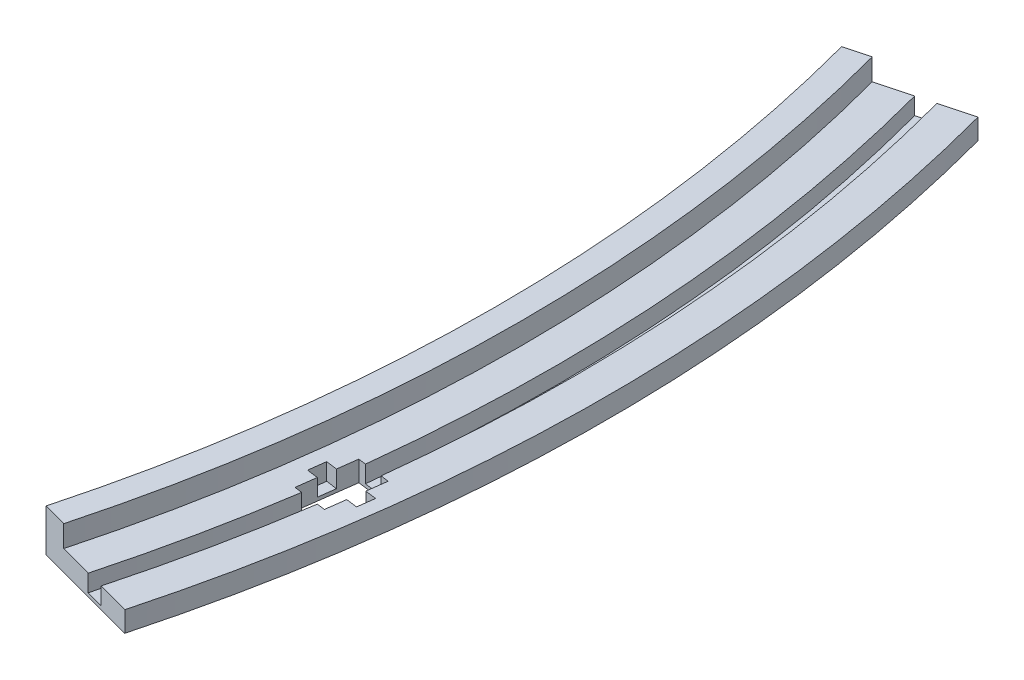
ISO-10303-21;
HEADER;
FILE_DESCRIPTION(('STEP AP214'),'2;1');
FILE_NAME('part.step','',(''),(''),'','','');
FILE_SCHEMA(('AUTOMOTIVE_DESIGN { 1 0 10303 214 1 1 1 1 }'));
ENDSEC;
DATA;
#1=APPLICATION_CONTEXT('core data for automotive mechanical design processes');
#2=APPLICATION_PROTOCOL_DEFINITION('international standard','automotive_design',2000,#1);
#3=PRODUCT_CONTEXT('',#1,'mechanical');
#4=PRODUCT('Part','Part','',(#3));
#5=PRODUCT_RELATED_PRODUCT_CATEGORY('part','',(#4));
#6=PRODUCT_DEFINITION_FORMATION('','',#4);
#7=PRODUCT_DEFINITION_CONTEXT('part definition',#1,'design');
#8=PRODUCT_DEFINITION('design','',#6,#7);
#9=PRODUCT_DEFINITION_SHAPE('','',#8);
#10=(LENGTH_UNIT() NAMED_UNIT(*) SI_UNIT(.MILLI.,.METRE.));
#11=(NAMED_UNIT(*) PLANE_ANGLE_UNIT() SI_UNIT($,.RADIAN.));
#12=(NAMED_UNIT(*) SI_UNIT($,.STERADIAN.) SOLID_ANGLE_UNIT());
#13=UNCERTAINTY_MEASURE_WITH_UNIT(LENGTH_MEASURE(1.E-05),#10,'distance_accuracy_value','');
#14=(GEOMETRIC_REPRESENTATION_CONTEXT(3) GLOBAL_UNCERTAINTY_ASSIGNED_CONTEXT((#13)) GLOBAL_UNIT_ASSIGNED_CONTEXT((#10,
#11,#12)) REPRESENTATION_CONTEXT('',''));
#15=CARTESIAN_POINT('',(0.,0.,0.));
#16=DIRECTION('',(0.,0.,1.));
#17=DIRECTION('',(1.,0.,0.));
#18=AXIS2_PLACEMENT_3D('',#15,#16,#17);
#19=CARTESIAN_POINT('',(0.,3.6,0.));
#20=DIRECTION('',(0.,1.,0.));
#21=DIRECTION('',(0.,0.,1.));
#22=AXIS2_PLACEMENT_3D('',#19,#20,#21);
#23=PLANE('',#22);
#24=DIRECTION('',(-0.965925826289068,0.,0.258819045102521));
#25=VECTOR('',#24,1.);
#26=CARTESIAN_POINT('',(280.11848962383,3.6,-75.0575230797313));
#27=LINE('',#26,#25);
#28=CARTESIAN_POINT('',(271.328564604599,3.6,-72.7022697692984));
#29=VERTEX_POINT('',#28);
#30=CARTESIAN_POINT('',(265.436417064236,3.6,-71.1234735941729));
#31=VERTEX_POINT('',#30);
#32=EDGE_CURVE('E57',#29,#31,#27,.T.);
#33=ORIENTED_EDGE('',*,*,#32,.T.);
#34=CARTESIAN_POINT('',(0.,3.6,0.));
#35=DIRECTION('',(0.,1.,0.));
#36=DIRECTION('',(0.,0.,1.));
#37=AXIS2_PLACEMENT_3D('',#34,#35,#36);
#38=CIRCLE('',#37,274.8);
#39=CARTESIAN_POINT('',(265.436417064236,3.6,71.1234735941729));
#40=VERTEX_POINT('',#39);
#41=EDGE_CURVE('E52',#40,#31,#38,.T.);
#42=ORIENTED_EDGE('',*,*,#41,.F.);
#43=DIRECTION('',(0.965925826289068,0.,0.258819045102522));
#44=VECTOR('',#43,1.);
#45=CARTESIAN_POINT('',(261.186343428564,3.6,69.9846697957218));
#46=LINE('',#45,#44);
#47=CARTESIAN_POINT('',(271.328564604599,3.6,72.7022697692983));
#48=VERTEX_POINT('',#47);
#49=EDGE_CURVE('E369',#40,#48,#46,.T.);
#50=ORIENTED_EDGE('',*,*,#49,.T.);
#51=CARTESIAN_POINT('',(0.,3.6,0.));
#52=DIRECTION('',(0.,-1.,0.));
#53=DIRECTION('',(0.,0.,1.));
#54=AXIS2_PLACEMENT_3D('',#51,#52,#53);
#55=CIRCLE('',#54,280.9);
#56=CARTESIAN_POINT('',(277.800107983747,3.6,41.6162228490094));
#57=VERTEX_POINT('',#56);
#58=EDGE_CURVE('E337',#57,#48,#55,.T.);
#59=ORIENTED_EDGE('',*,*,#58,.F.);
#60=DIRECTION('',(0.991444861373811,0.,0.130526192220051));
#61=VECTOR('',#60,1.);
#62=CARTESIAN_POINT('',(276.45620779288,3.6,41.4392950323736));
#63=LINE('',#62,#61);
#64=CARTESIAN_POINT('',(276.45620779288,3.6,41.4392950323736));
#65=VERTEX_POINT('',#64);
#66=EDGE_CURVE('E306',#65,#57,#63,.T.);
#67=ORIENTED_EDGE('',*,*,#66,.F.);
#68=DIRECTION('',(-0.130526192220048,0.,0.991444861373811));
#69=VECTOR('',#68,1.);
#70=CARTESIAN_POINT('',(277.76146971508,3.6,31.5248464186355));
#71=LINE('',#70,#69);
#72=CARTESIAN_POINT('',(276.91304946565,3.6,37.9692380175652));
#73=VERTEX_POINT('',#72);
#74=EDGE_CURVE('E287',#73,#65,#71,.T.);
#75=ORIENTED_EDGE('',*,*,#74,.F.);
#76=DIRECTION('',(0.991444861373811,0.,0.130526192220048));
#77=VECTOR('',#76,1.);
#78=CARTESIAN_POINT('',(284.844608356641,3.6,39.0134475553256));
#79=LINE('',#78,#77);
#80=CARTESIAN_POINT('',(274.930159742902,3.6,37.7081856331251));
#81=VERTEX_POINT('',#80);
#82=EDGE_CURVE('E262',#81,#73,#79,.T.);
#83=ORIENTED_EDGE('',*,*,#82,.F.);
#84=DIRECTION('',(-0.130526192220056,0.,0.99144486137381));
#85=VECTOR('',#84,1.);
#86=CARTESIAN_POINT('',(274.930159742902,3.6,37.7081856331251));
#87=LINE('',#86,#85);
#88=CARTESIAN_POINT('',(275.321738319563,3.6,34.7338510490037));
#89=VERTEX_POINT('',#88);
#90=EDGE_CURVE('E244',#89,#81,#87,.T.);
#91=ORIENTED_EDGE('',*,*,#90,.F.);
#92=DIRECTION('',(-0.991444861373811,0.,-0.130526192220048));
#93=VECTOR('',#92,1.);
#94=CARTESIAN_POINT('',(275.321738319563,3.6,34.7338510490037));
#95=LINE('',#94,#93);
#96=CARTESIAN_POINT('',(277.30462804231,3.6,34.9949034334438));
#97=VERTEX_POINT('',#96);
#98=EDGE_CURVE('E267',#97,#89,#95,.T.);
#99=ORIENTED_EDGE('',*,*,#98,.F.);
#100=CARTESIAN_POINT('',(277.76146971508,3.6,31.5248464186355));
#101=VERTEX_POINT('',#100);
#102=EDGE_CURVE('E302',#101,#97,#71,.T.);
#103=ORIENTED_EDGE('',*,*,#102,.F.);
#104=DIRECTION('',(-0.99144486137381,0.,-0.130526192220052));
#105=VECTOR('',#104,1.);
#106=CARTESIAN_POINT('',(283.710138883323,3.6,32.3080035719558));
#107=LINE('',#106,#105);
#108=CARTESIAN_POINT('',(279.105369905948,3.6,31.7017742352713));
#109=VERTEX_POINT('',#108);
#110=EDGE_CURVE('E312',#109,#101,#107,.T.);
#111=ORIENTED_EDGE('',*,*,#110,.F.);
#112=EDGE_CURVE('E353',#29,#109,#55,.T.);
#113=ORIENTED_EDGE('',*,*,#112,.F.);
#114=EDGE_LOOP('',(#33,#42,#50,#59,#67,#75,#83,#91,#99,#103,#111,#113));
#115=FACE_BOUND('',#114,.T.);
#116=ADVANCED_FACE('F37',(#115),#23,.T.);
#117=CARTESIAN_POINT('',(0.,0.599999999999999,0.));
#118=DIRECTION('',(0.,1.,0.));
#119=DIRECTION('',(0.,0.,1.));
#120=AXIS2_PLACEMENT_3D('',#117,#118,#119);
#121=CYLINDRICAL_SURFACE('',#120,280.9);
#122=ORIENTED_EDGE('',*,*,#112,.T.);
#123=DIRECTION('',(0.,1.,0.));
#124=VECTOR('',#123,1.);
#125=CARTESIAN_POINT('',(279.105369905948,0.599999999999999,31.7017742352713));
#126=LINE('',#125,#124);
#127=CARTESIAN_POINT('',(279.105369905948,0.599999999999999,31.7017742352713));
#128=VERTEX_POINT('',#127);
#129=EDGE_CURVE('E334',#109,#128,#126,.F.);
#130=ORIENTED_EDGE('',*,*,#129,.T.);
#131=CARTESIAN_POINT('',(0.,0.599999999999999,0.));
#132=DIRECTION('',(0.,-1.,0.));
#133=DIRECTION('',(0.,0.,1.));
#134=AXIS2_PLACEMENT_3D('',#131,#132,#133);
#135=CIRCLE('',#134,280.9);
#136=CARTESIAN_POINT('',(271.328564604599,0.599999999999999,-72.7022697692984));
#137=VERTEX_POINT('',#136);
#138=EDGE_CURVE('E338',#137,#128,#135,.T.);
#139=ORIENTED_EDGE('',*,*,#138,.F.);
#140=DIRECTION('',(0.,1.,0.));
#141=VECTOR('',#140,1.);
#142=CARTESIAN_POINT('',(271.328564604599,0.599999999999999,-72.7022697692984));
#143=LINE('',#142,#141);
#144=EDGE_CURVE('E360',#137,#29,#143,.T.);
#145=ORIENTED_EDGE('',*,*,#144,.T.);
#146=EDGE_LOOP('',(#122,#130,#139,#145));
#147=FACE_BOUND('',#146,.T.);
#148=ADVANCED_FACE('F436',(#147),#121,.T.);
#149=CARTESIAN_POINT('',(0.,0.599999999999999,0.));
#150=DIRECTION('',(0.,1.,0.));
#151=DIRECTION('',(0.,0.,1.));
#152=AXIS2_PLACEMENT_3D('',#149,#150,#151);
#153=CYLINDRICAL_SURFACE('',#152,284.1);
#154=CARTESIAN_POINT('',(0.,0.599999999999999,0.));
#155=DIRECTION('',(0.,1.,0.));
#156=DIRECTION('',(0.,0.,1.));
#157=AXIS2_PLACEMENT_3D('',#154,#155,#156);
#158=CIRCLE('',#157,284.1);
#159=CARTESIAN_POINT('',(282.278490521001,0.599999999999999,32.1195234893891));
#160=VERTEX_POINT('',#159);
#161=CARTESIAN_POINT('',(274.419527248724,0.599999999999999,-73.5304907136264));
#162=VERTEX_POINT('',#161);
#163=EDGE_CURVE('E345',#160,#162,#158,.T.);
#164=ORIENTED_EDGE('',*,*,#163,.F.);
#165=DIRECTION('',(0.,1.,0.));
#166=VECTOR('',#165,1.);
#167=CARTESIAN_POINT('',(282.278490521001,0.599999999999999,32.1195234893891));
#168=LINE('',#167,#166);
#169=CARTESIAN_POINT('',(282.278490521001,3.6,32.1195234893891));
#170=VERTEX_POINT('',#169);
#171=EDGE_CURVE('E331',#160,#170,#168,.T.);
#172=ORIENTED_EDGE('',*,*,#171,.T.);
#173=CARTESIAN_POINT('',(0.,3.6,0.));
#174=DIRECTION('',(0.,1.,0.));
#175=DIRECTION('',(0.,0.,1.));
#176=AXIS2_PLACEMENT_3D('',#173,#174,#175);
#177=CIRCLE('',#176,284.1);
#178=CARTESIAN_POINT('',(274.419527248724,3.6,-73.5304907136264));
#179=VERTEX_POINT('',#178);
#180=EDGE_CURVE('E356',#170,#179,#177,.T.);
#181=ORIENTED_EDGE('',*,*,#180,.T.);
#182=DIRECTION('',(0.,1.,0.));
#183=VECTOR('',#182,1.);
#184=CARTESIAN_POINT('',(274.419527248724,0.599999999999999,-73.5304907136264));
#185=LINE('',#184,#183);
#186=EDGE_CURVE('E362',#162,#179,#185,.T.);
#187=ORIENTED_EDGE('',*,*,#186,.F.);
#188=EDGE_LOOP('',(#164,#172,#181,#187));
#189=FACE_BOUND('',#188,.T.);
#190=ADVANCED_FACE('F428',(#189),#153,.F.);
#191=CARTESIAN_POINT('',(0.,0.599999999999999,0.));
#192=DIRECTION('',(0.,1.,0.));
#193=DIRECTION('',(0.,0.,1.));
#194=AXIS2_PLACEMENT_3D('',#191,#192,#193);
#195=PLANE('',#194);
#196=DIRECTION('',(-0.99144486137381,0.,-0.130526192220052));
#197=VECTOR('',#196,1.);
#198=CARTESIAN_POINT('',(0.652630961100261,0.599999999999999,-4.95722430686906));
#199=LINE('',#198,#197);
#200=EDGE_CURVE('E392',#160,#128,#199,.T.);
#201=ORIENTED_EDGE('',*,*,#200,.F.);
#202=ORIENTED_EDGE('',*,*,#163,.T.);
#203=DIRECTION('',(-0.965925826289068,0.,0.258819045102521));
#204=VECTOR('',#203,1.);
#205=CARTESIAN_POINT('',(271.328564604599,0.599999999999999,-72.7022697692984));
#206=LINE('',#205,#204);
#207=EDGE_CURVE('E349',#162,#137,#206,.T.);
#208=ORIENTED_EDGE('',*,*,#207,.T.);
#209=ORIENTED_EDGE('',*,*,#138,.T.);
#210=EDGE_LOOP('',(#201,#202,#208,#209));
#211=FACE_BOUND('',#210,.T.);
#212=ADVANCED_FACE('F432',(#211),#195,.T.);
#213=CARTESIAN_POINT('',(0.,3.6,0.));
#214=DIRECTION('',(0.,-1.,0.));
#215=DIRECTION('',(0.,0.,-1.));
#216=AXIS2_PLACEMENT_3D('',#213,#214,#215);
#217=CYLINDRICAL_SURFACE('',#216,270.4);
#218=CARTESIAN_POINT('',(0.,0.,0.));
#219=DIRECTION('',(0.,-1.,0.));
#220=DIRECTION('',(0.,0.,1.));
#221=AXIS2_PLACEMENT_3D('',#218,#219,#220);
#222=CIRCLE('',#221,270.4);
#223=CARTESIAN_POINT('',(261.186343428564,0.,-69.9846697957218));
#224=VERTEX_POINT('',#223);
#225=CARTESIAN_POINT('',(261.186343428564,0.,69.9846697957218));
#226=VERTEX_POINT('',#225);
#227=EDGE_CURVE('E216',#224,#226,#222,.T.);
#228=ORIENTED_EDGE('',*,*,#227,.T.);
#229=DIRECTION('',(0.,-1.,0.));
#230=VECTOR('',#229,1.);
#231=CARTESIAN_POINT('',(261.186343428564,3.6,69.9846697957218));
#232=LINE('',#231,#230);
#233=CARTESIAN_POINT('',(261.186343428564,7.4,69.9846697957218));
#234=VERTEX_POINT('',#233);
#235=EDGE_CURVE('E210',#234,#226,#232,.T.);
#236=ORIENTED_EDGE('',*,*,#235,.F.);
#237=CARTESIAN_POINT('',(0.,7.4,0.));
#238=DIRECTION('',(0.,-1.,0.));
#239=DIRECTION('',(0.,0.,1.));
#240=AXIS2_PLACEMENT_3D('',#237,#238,#239);
#241=CIRCLE('',#240,270.4);
#242=CARTESIAN_POINT('',(261.186343428564,7.4,-69.9846697957218));
#243=VERTEX_POINT('',#242);
#244=EDGE_CURVE('E214',#243,#234,#241,.T.);
#245=ORIENTED_EDGE('',*,*,#244,.F.);
#246=DIRECTION('',(0.,-1.,0.));
#247=VECTOR('',#246,1.);
#248=CARTESIAN_POINT('',(261.186343428564,3.6,-69.9846697957218));
#249=LINE('',#248,#247);
#250=EDGE_CURVE('E377',#243,#224,#249,.T.);
#251=ORIENTED_EDGE('',*,*,#250,.T.);
#252=EDGE_LOOP('',(#228,#236,#245,#251));
#253=FACE_BOUND('',#252,.T.);
#254=ADVANCED_FACE('F39',(#253),#217,.F.);
#255=CARTESIAN_POINT('',(261.186343428564,3.6,69.9846697957218));
#256=DIRECTION('',(0.258819045102522,0.,-0.965925826289068));
#257=DIRECTION('',(-0.965925826289068,0.,-0.258819045102522));
#258=AXIS2_PLACEMENT_3D('',#255,#256,#257);
#259=PLANE('',#258);
#260=DIRECTION('',(0.965925826289068,0.,0.25881904510252));
#261=VECTOR('',#260,1.);
#262=CARTESIAN_POINT('',(271.328564604599,0.599999999999999,72.7022697692983));
#263=LINE('',#262,#261);
#264=CARTESIAN_POINT('',(271.328564604599,0.599999999999999,72.7022697692983));
#265=VERTEX_POINT('',#264);
#266=CARTESIAN_POINT('',(274.419527248724,0.599999999999999,73.5304907136264));
#267=VERTEX_POINT('',#266);
#268=EDGE_CURVE('E341',#265,#267,#263,.T.);
#269=ORIENTED_EDGE('',*,*,#268,.F.);
#270=DIRECTION('',(0.,1.,0.));
#271=VECTOR('',#270,1.);
#272=CARTESIAN_POINT('',(271.328564604599,0.599999999999999,72.7022697692983));
#273=LINE('',#272,#271);
#274=EDGE_CURVE('E352',#265,#48,#273,.T.);
#275=ORIENTED_EDGE('',*,*,#274,.T.);
#276=ORIENTED_EDGE('',*,*,#49,.F.);
#277=DIRECTION('',(0.,-1.,0.));
#278=VECTOR('',#277,1.);
#279=CARTESIAN_POINT('',(265.436417064236,7.4,71.1234735941729));
#280=LINE('',#279,#278);
#281=CARTESIAN_POINT('',(265.436417064236,7.4,71.1234735941729));
#282=VERTEX_POINT('',#281);
#283=EDGE_CURVE('E226',#282,#40,#280,.T.);
#284=ORIENTED_EDGE('',*,*,#283,.F.);
#285=DIRECTION('',(0.965925826289066,0.,0.258819045102528));
#286=VECTOR('',#285,1.);
#287=CARTESIAN_POINT('',(265.436417064236,7.4,71.1234735941729));
#288=LINE('',#287,#286);
#289=EDGE_CURVE('E222',#234,#282,#288,.T.);
#290=ORIENTED_EDGE('',*,*,#289,.F.);
#291=ORIENTED_EDGE('',*,*,#235,.T.);
#292=DIRECTION('',(0.965925826289068,0.,0.258819045102522));
#293=VECTOR('',#292,1.);
#294=CARTESIAN_POINT('',(261.186343428564,0.,69.9846697957218));
#295=LINE('',#294,#293);
#296=CARTESIAN_POINT('',(280.11848962383,0.,75.0575230797312));
#297=VERTEX_POINT('',#296);
#298=EDGE_CURVE('E379',#226,#297,#295,.T.);
#299=ORIENTED_EDGE('',*,*,#298,.T.);
#300=DIRECTION('',(0.,-1.,0.));
#301=VECTOR('',#300,1.);
#302=CARTESIAN_POINT('',(280.11848962383,3.6,75.0575230797312));
#303=LINE('',#302,#301);
#304=CARTESIAN_POINT('',(280.11848962383,3.6,75.0575230797312));
#305=VERTEX_POINT('',#304);
#306=EDGE_CURVE('E219',#305,#297,#303,.T.);
#307=ORIENTED_EDGE('',*,*,#306,.F.);
#308=CARTESIAN_POINT('',(274.419527248724,3.6,73.5304907136264));
#309=VERTEX_POINT('',#308);
#310=EDGE_CURVE('E372',#309,#305,#46,.T.);
#311=ORIENTED_EDGE('',*,*,#310,.F.);
#312=DIRECTION('',(0.,1.,0.));
#313=VECTOR('',#312,1.);
#314=CARTESIAN_POINT('',(274.419527248724,0.599999999999999,73.5304907136264));
#315=LINE('',#314,#313);
#316=EDGE_CURVE('E365',#267,#309,#315,.T.);
#317=ORIENTED_EDGE('',*,*,#316,.F.);
#318=EDGE_LOOP('',(#269,#275,#276,#284,#290,#291,#299,#307,#311,#317));
#319=FACE_BOUND('',#318,.T.);
#320=ADVANCED_FACE('F224',(#319),#259,.F.);
#321=CARTESIAN_POINT('',(0.,3.6,0.));
#322=DIRECTION('',(0.,-1.,0.));
#323=DIRECTION('',(0.,0.,-1.));
#324=AXIS2_PLACEMENT_3D('',#321,#322,#323);
#325=CYLINDRICAL_SURFACE('',#324,290.);
#326=CARTESIAN_POINT('',(0.,0.,0.));
#327=DIRECTION('',(0.,1.,0.));
#328=DIRECTION('',(0.,0.,1.));
#329=AXIS2_PLACEMENT_3D('',#326,#327,#328);
#330=CIRCLE('',#329,290.);
#331=CARTESIAN_POINT('',(280.11848962383,0.,-75.0575230797313));
#332=VERTEX_POINT('',#331);
#333=EDGE_CURVE('E381',#297,#332,#330,.T.);
#334=ORIENTED_EDGE('',*,*,#333,.T.);
#335=DIRECTION('',(0.,-1.,0.));
#336=VECTOR('',#335,1.);
#337=CARTESIAN_POINT('',(280.11848962383,3.6,-75.0575230797313));
#338=LINE('',#337,#336);
#339=CARTESIAN_POINT('',(280.11848962383,3.6,-75.0575230797313));
#340=VERTEX_POINT('',#339);
#341=EDGE_CURVE('E386',#340,#332,#338,.T.);
#342=ORIENTED_EDGE('',*,*,#341,.F.);
#343=CARTESIAN_POINT('',(0.,3.6,0.));
#344=DIRECTION('',(0.,1.,0.));
#345=DIRECTION('',(0.,0.,1.));
#346=AXIS2_PLACEMENT_3D('',#343,#344,#345);
#347=CIRCLE('',#346,290.);
#348=EDGE_CURVE('E371',#305,#340,#347,.T.);
#349=ORIENTED_EDGE('',*,*,#348,.F.);
#350=ORIENTED_EDGE('',*,*,#306,.T.);
#351=EDGE_LOOP('',(#334,#342,#349,#350));
#352=FACE_BOUND('',#351,.T.);
#353=ADVANCED_FACE('F470',(#352),#325,.T.);
#354=CARTESIAN_POINT('',(280.11848962383,3.6,-75.0575230797313));
#355=DIRECTION('',(0.258819045102521,0.,0.965925826289068));
#356=DIRECTION('',(0.965925826289068,0.,-0.258819045102521));
#357=AXIS2_PLACEMENT_3D('',#354,#355,#356);
#358=PLANE('',#357);
#359=ORIENTED_EDGE('',*,*,#32,.F.);
#360=ORIENTED_EDGE('',*,*,#144,.F.);
#361=ORIENTED_EDGE('',*,*,#207,.F.);
#362=ORIENTED_EDGE('',*,*,#186,.T.);
#363=EDGE_CURVE('E374',#340,#179,#27,.T.);
#364=ORIENTED_EDGE('',*,*,#363,.F.);
#365=ORIENTED_EDGE('',*,*,#341,.T.);
#366=DIRECTION('',(-0.965925826289068,0.,0.258819045102521));
#367=VECTOR('',#366,1.);
#368=CARTESIAN_POINT('',(280.11848962383,0.,-75.0575230797313));
#369=LINE('',#368,#367);
#370=EDGE_CURVE('E383',#332,#224,#369,.T.);
#371=ORIENTED_EDGE('',*,*,#370,.T.);
#372=ORIENTED_EDGE('',*,*,#250,.F.);
#373=DIRECTION('',(-0.965925826289066,0.,0.258819045102528));
#374=VECTOR('',#373,1.);
#375=CARTESIAN_POINT('',(261.186343428564,7.4,-69.9846697957218));
#376=LINE('',#375,#374);
#377=CARTESIAN_POINT('',(265.436417064236,7.4,-71.1234735941729));
#378=VERTEX_POINT('',#377);
#379=EDGE_CURVE('E234',#378,#243,#376,.T.);
#380=ORIENTED_EDGE('',*,*,#379,.F.);
#381=DIRECTION('',(0.,-1.,0.));
#382=VECTOR('',#381,1.);
#383=CARTESIAN_POINT('',(265.436417064236,7.4,-71.1234735941729));
#384=LINE('',#383,#382);
#385=EDGE_CURVE('E239',#378,#31,#384,.T.);
#386=ORIENTED_EDGE('',*,*,#385,.T.);
#387=EDGE_LOOP('',(#359,#360,#361,#362,#364,#365,#371,#372,#380,#386));
#388=FACE_BOUND('',#387,.T.);
#389=ADVANCED_FACE('F439',(#388),#358,.F.);
#390=CARTESIAN_POINT('',(285.236186933301,3.6,36.0391129712042));
#391=VERTEX_POINT('',#390);
#392=CARTESIAN_POINT('',(283.253297210553,3.6,35.7780605867641));
#393=VERTEX_POINT('',#392);
#394=EDGE_CURVE('E249',#391,#393,#95,.T.);
#395=ORIENTED_EDGE('',*,*,#394,.F.);
#396=DIRECTION('',(0.130526192220038,0.,-0.991444861373812));
#397=VECTOR('',#396,1.);
#398=CARTESIAN_POINT('',(285.236186933301,3.6,36.0391129712042));
#399=LINE('',#398,#397);
#400=CARTESIAN_POINT('',(284.844608356641,3.6,39.0134475553256));
#401=VERTEX_POINT('',#400);
#402=EDGE_CURVE('E264',#401,#391,#399,.T.);
#403=ORIENTED_EDGE('',*,*,#402,.F.);
#404=CARTESIAN_POINT('',(282.861718633893,3.6,38.7523951708855));
#405=VERTEX_POINT('',#404);
#406=EDGE_CURVE('E261',#405,#401,#79,.T.);
#407=ORIENTED_EDGE('',*,*,#406,.F.);
#408=DIRECTION('',(0.130526192220054,0.,-0.99144486137381));
#409=VECTOR('',#408,1.);
#410=CARTESIAN_POINT('',(282.404876961123,3.6,42.2224521856939));
#411=LINE('',#410,#409);
#412=CARTESIAN_POINT('',(282.404876961123,3.6,42.2224521856939));
#413=VERTEX_POINT('',#412);
#414=EDGE_CURVE('E309',#413,#405,#411,.T.);
#415=ORIENTED_EDGE('',*,*,#414,.F.);
#416=CARTESIAN_POINT('',(280.9732285988,3.6,42.0339721031272));
#417=VERTEX_POINT('',#416);
#418=EDGE_CURVE('E305',#417,#413,#63,.T.);
#419=ORIENTED_EDGE('',*,*,#418,.F.);
#420=EDGE_CURVE('E357',#309,#417,#177,.T.);
#421=ORIENTED_EDGE('',*,*,#420,.F.);
#422=ORIENTED_EDGE('',*,*,#310,.T.);
#423=ORIENTED_EDGE('',*,*,#348,.T.);
#424=ORIENTED_EDGE('',*,*,#363,.T.);
#425=ORIENTED_EDGE('',*,*,#180,.F.);
#426=CARTESIAN_POINT('',(283.710138883323,3.6,32.3080035719558));
#427=VERTEX_POINT('',#426);
#428=EDGE_CURVE('E292',#427,#170,#107,.T.);
#429=ORIENTED_EDGE('',*,*,#428,.F.);
#430=EDGE_CURVE('E308',#393,#427,#411,.T.);
#431=ORIENTED_EDGE('',*,*,#430,.F.);
#432=EDGE_LOOP('',(#395,#403,#407,#415,#419,#421,#422,#423,#424,#425,#429,#431));
#433=FACE_BOUND('',#432,.T.);
#434=ADVANCED_FACE('F408',(#433),#23,.T.);
#435=CARTESIAN_POINT('',(0.,0.,0.));
#436=DIRECTION('',(0.,1.,0.));
#437=DIRECTION('',(0.,0.,1.));
#438=AXIS2_PLACEMENT_3D('',#435,#436,#437);
#439=PLANE('',#438);
#440=DIRECTION('',(-0.99144486137381,0.,-0.130526192220052));
#441=VECTOR('',#440,1.);
#442=CARTESIAN_POINT('',(283.710138883323,0.,32.3080035719558));
#443=LINE('',#442,#441);
#444=CARTESIAN_POINT('',(283.710138883323,0.,32.3080035719558));
#445=VERTEX_POINT('',#444);
#446=CARTESIAN_POINT('',(277.76146971508,0.,31.5248464186355));
#447=VERTEX_POINT('',#446);
#448=EDGE_CURVE('E298',#445,#447,#443,.T.);
#449=ORIENTED_EDGE('',*,*,#448,.T.);
#450=DIRECTION('',(-0.130526192220048,0.,0.991444861373811));
#451=VECTOR('',#450,1.);
#452=CARTESIAN_POINT('',(277.76146971508,0.,31.5248464186355));
#453=LINE('',#452,#451);
#454=CARTESIAN_POINT('',(276.45620779288,0.,41.4392950323736));
#455=VERTEX_POINT('',#454);
#456=EDGE_CURVE('E288',#447,#455,#453,.T.);
#457=ORIENTED_EDGE('',*,*,#456,.T.);
#458=DIRECTION('',(0.991444861373811,0.,0.130526192220051));
#459=VECTOR('',#458,1.);
#460=CARTESIAN_POINT('',(276.45620779288,0.,41.4392950323736));
#461=LINE('',#460,#459);
#462=CARTESIAN_POINT('',(282.404876961123,0.,42.2224521856939));
#463=VERTEX_POINT('',#462);
#464=EDGE_CURVE('E291',#455,#463,#461,.T.);
#465=ORIENTED_EDGE('',*,*,#464,.T.);
#466=DIRECTION('',(0.130526192220054,0.,-0.99144486137381));
#467=VECTOR('',#466,1.);
#468=CARTESIAN_POINT('',(282.404876961123,0.,42.2224521856939));
#469=LINE('',#468,#467);
#470=EDGE_CURVE('E295',#463,#445,#469,.T.);
#471=ORIENTED_EDGE('',*,*,#470,.T.);
#472=EDGE_LOOP('',(#449,#457,#465,#471));
#473=FACE_BOUND('',#472,.T.);
#474=ORIENTED_EDGE('',*,*,#227,.F.);
#475=ORIENTED_EDGE('',*,*,#370,.F.);
#476=ORIENTED_EDGE('',*,*,#333,.F.);
#477=ORIENTED_EDGE('',*,*,#298,.F.);
#478=EDGE_LOOP('',(#474,#475,#476,#477));
#479=FACE_BOUND('',#478,.T.);
#480=ADVANCED_FACE('F464',(#473,#479),#439,.F.);
#481=CARTESIAN_POINT('',(277.800107983747,0.599999999999999,41.6162228490094));
#482=VERTEX_POINT('',#481);
#483=EDGE_CURVE('E342',#482,#265,#135,.T.);
#484=ORIENTED_EDGE('',*,*,#483,.F.);
#485=DIRECTION('',(0.,1.,0.));
#486=VECTOR('',#485,1.);
#487=CARTESIAN_POINT('',(277.800107983747,0.599999999999999,41.6162228490094));
#488=LINE('',#487,#486);
#489=EDGE_CURVE('E328',#482,#57,#488,.T.);
#490=ORIENTED_EDGE('',*,*,#489,.T.);
#491=ORIENTED_EDGE('',*,*,#58,.T.);
#492=ORIENTED_EDGE('',*,*,#274,.F.);
#493=EDGE_LOOP('',(#484,#490,#491,#492));
#494=FACE_BOUND('',#493,.T.);
#495=ADVANCED_FACE('F461',(#494),#121,.T.);
#496=ORIENTED_EDGE('',*,*,#420,.T.);
#497=DIRECTION('',(0.,1.,0.));
#498=VECTOR('',#497,1.);
#499=CARTESIAN_POINT('',(280.9732285988,0.599999999999999,42.0339721031272));
#500=LINE('',#499,#498);
#501=CARTESIAN_POINT('',(280.9732285988,0.599999999999999,42.0339721031272));
#502=VERTEX_POINT('',#501);
#503=EDGE_CURVE('E317',#417,#502,#500,.F.);
#504=ORIENTED_EDGE('',*,*,#503,.T.);
#505=EDGE_CURVE('E346',#267,#502,#158,.T.);
#506=ORIENTED_EDGE('',*,*,#505,.F.);
#507=ORIENTED_EDGE('',*,*,#316,.T.);
#508=EDGE_LOOP('',(#496,#504,#506,#507));
#509=FACE_BOUND('',#508,.T.);
#510=ADVANCED_FACE('F490',(#509),#153,.F.);
#511=DIRECTION('',(0.99144486137381,0.,0.130526192220051));
#512=VECTOR('',#511,1.);
#513=CARTESIAN_POINT('',(-0.652630961100292,0.599999999999999,4.95722430686934));
#514=LINE('',#513,#512);
#515=EDGE_CURVE('E218',#482,#502,#514,.T.);
#516=ORIENTED_EDGE('',*,*,#515,.F.);
#517=ORIENTED_EDGE('',*,*,#483,.T.);
#518=ORIENTED_EDGE('',*,*,#268,.T.);
#519=ORIENTED_EDGE('',*,*,#505,.T.);
#520=EDGE_LOOP('',(#516,#517,#518,#519));
#521=FACE_BOUND('',#520,.T.);
#522=ADVANCED_FACE('F485',(#521),#195,.T.);
#523=CARTESIAN_POINT('',(283.710138883323,0.,32.3080035719558));
#524=DIRECTION('',(0.130526192220052,0.,-0.99144486137381));
#525=DIRECTION('',(-0.99144486137381,0.,-0.130526192220052));
#526=AXIS2_PLACEMENT_3D('',#523,#524,#525);
#527=PLANE('',#526);
#528=ORIENTED_EDGE('',*,*,#110,.T.);
#529=DIRECTION('',(0.,1.,0.));
#530=VECTOR('',#529,1.);
#531=CARTESIAN_POINT('',(277.76146971508,0.,31.5248464186355));
#532=LINE('',#531,#530);
#533=EDGE_CURVE('E314',#447,#101,#532,.T.);
#534=ORIENTED_EDGE('',*,*,#533,.F.);
#535=ORIENTED_EDGE('',*,*,#448,.F.);
#536=DIRECTION('',(0.,1.,0.));
#537=VECTOR('',#536,1.);
#538=CARTESIAN_POINT('',(283.710138883323,0.,32.3080035719558));
#539=LINE('',#538,#537);
#540=EDGE_CURVE('E318',#445,#427,#539,.T.);
#541=ORIENTED_EDGE('',*,*,#540,.T.);
#542=ORIENTED_EDGE('',*,*,#428,.T.);
#543=ORIENTED_EDGE('',*,*,#171,.F.);
#544=ORIENTED_EDGE('',*,*,#200,.T.);
#545=ORIENTED_EDGE('',*,*,#129,.F.);
#546=EDGE_LOOP('',(#528,#534,#535,#541,#542,#543,#544,#545));
#547=FACE_BOUND('',#546,.T.);
#548=ADVANCED_FACE('F423',(#547),#527,.F.);
#549=CARTESIAN_POINT('',(276.45620779288,0.,41.4392950323736));
#550=DIRECTION('',(-0.130526192220051,0.,0.99144486137381));
#551=DIRECTION('',(0.99144486137381,0.,0.130526192220051));
#552=AXIS2_PLACEMENT_3D('',#549,#550,#551);
#553=PLANE('',#552);
#554=ORIENTED_EDGE('',*,*,#515,.T.);
#555=ORIENTED_EDGE('',*,*,#503,.F.);
#556=ORIENTED_EDGE('',*,*,#418,.T.);
#557=DIRECTION('',(0.,1.,0.));
#558=VECTOR('',#557,1.);
#559=CARTESIAN_POINT('',(282.404876961123,0.,42.2224521856939));
#560=LINE('',#559,#558);
#561=EDGE_CURVE('E321',#463,#413,#560,.T.);
#562=ORIENTED_EDGE('',*,*,#561,.F.);
#563=ORIENTED_EDGE('',*,*,#464,.F.);
#564=DIRECTION('',(0.,1.,0.));
#565=VECTOR('',#564,1.);
#566=CARTESIAN_POINT('',(276.45620779288,0.,41.4392950323736));
#567=LINE('',#566,#565);
#568=EDGE_CURVE('E301',#455,#65,#567,.T.);
#569=ORIENTED_EDGE('',*,*,#568,.T.);
#570=ORIENTED_EDGE('',*,*,#66,.T.);
#571=ORIENTED_EDGE('',*,*,#489,.F.);
#572=EDGE_LOOP('',(#554,#555,#556,#562,#563,#569,#570,#571));
#573=FACE_BOUND('',#572,.T.);
#574=ADVANCED_FACE('F498',(#573),#553,.F.);
#575=CARTESIAN_POINT('',(277.76146971508,0.,31.5248464186355));
#576=DIRECTION('',(-0.991444861373811,0.,-0.130526192220048));
#577=DIRECTION('',(-0.130526192220048,0.,0.991444861373811));
#578=AXIS2_PLACEMENT_3D('',#575,#576,#577);
#579=PLANE('',#578);
#580=ORIENTED_EDGE('',*,*,#102,.T.);
#581=DIRECTION('',(0.,-1.,0.));
#582=VECTOR('',#581,1.);
#583=CARTESIAN_POINT('',(277.30462804231,0.,34.9949034334438));
#584=LINE('',#583,#582);
#585=CARTESIAN_POINT('',(277.30462804231,0.599999999999999,34.9949034334438));
#586=VERTEX_POINT('',#585);
#587=EDGE_CURVE('E284',#97,#586,#584,.T.);
#588=ORIENTED_EDGE('',*,*,#587,.T.);
#589=DIRECTION('',(-0.130526192220048,0.,0.991444861373811));
#590=VECTOR('',#589,1.);
#591=CARTESIAN_POINT('',(277.76146971508,0.599999999999999,31.5248464186355));
#592=LINE('',#591,#590);
#593=CARTESIAN_POINT('',(276.91304946565,0.599999999999999,37.9692380175652));
#594=VERTEX_POINT('',#593);
#595=EDGE_CURVE('E272',#586,#594,#592,.T.);
#596=ORIENTED_EDGE('',*,*,#595,.T.);
#597=DIRECTION('',(0.,1.,0.));
#598=VECTOR('',#597,1.);
#599=CARTESIAN_POINT('',(276.91304946565,0.,37.9692380175652));
#600=LINE('',#599,#598);
#601=EDGE_CURVE('E281',#594,#73,#600,.T.);
#602=ORIENTED_EDGE('',*,*,#601,.T.);
#603=ORIENTED_EDGE('',*,*,#74,.T.);
#604=ORIENTED_EDGE('',*,*,#568,.F.);
#605=ORIENTED_EDGE('',*,*,#456,.F.);
#606=ORIENTED_EDGE('',*,*,#533,.T.);
#607=EDGE_LOOP('',(#580,#588,#596,#602,#603,#604,#605,#606));
#608=FACE_BOUND('',#607,.T.);
#609=ADVANCED_FACE('F521',(#608),#579,.F.);
#610=CARTESIAN_POINT('',(282.404876961123,0.,42.2224521856939));
#611=DIRECTION('',(0.99144486137381,0.,0.130526192220054));
#612=DIRECTION('',(0.130526192220054,0.,-0.99144486137381));
#613=AXIS2_PLACEMENT_3D('',#610,#611,#612);
#614=PLANE('',#613);
#615=DIRECTION('',(0.130526192220054,0.,-0.99144486137381));
#616=VECTOR('',#615,1.);
#617=CARTESIAN_POINT('',(282.404876961123,0.599999999999999,42.2224521856939));
#618=LINE('',#617,#616);
#619=CARTESIAN_POINT('',(282.861718633893,0.599999999999999,38.7523951708855));
#620=VERTEX_POINT('',#619);
#621=CARTESIAN_POINT('',(283.253297210553,0.599999999999999,35.7780605867641));
#622=VERTEX_POINT('',#621);
#623=EDGE_CURVE('E394',#620,#622,#618,.T.);
#624=ORIENTED_EDGE('',*,*,#623,.T.);
#625=DIRECTION('',(0.,1.,0.));
#626=VECTOR('',#625,1.);
#627=CARTESIAN_POINT('',(283.253297210553,0.,35.7780605867641));
#628=LINE('',#627,#626);
#629=EDGE_CURVE('E11',#622,#393,#628,.T.);
#630=ORIENTED_EDGE('',*,*,#629,.T.);
#631=ORIENTED_EDGE('',*,*,#430,.T.);
#632=ORIENTED_EDGE('',*,*,#540,.F.);
#633=ORIENTED_EDGE('',*,*,#470,.F.);
#634=ORIENTED_EDGE('',*,*,#561,.T.);
#635=ORIENTED_EDGE('',*,*,#414,.T.);
#636=DIRECTION('',(0.,-1.,0.));
#637=VECTOR('',#636,1.);
#638=CARTESIAN_POINT('',(282.861718633893,0.,38.7523951708855));
#639=LINE('',#638,#637);
#640=EDGE_CURVE('E45',#405,#620,#639,.T.);
#641=ORIENTED_EDGE('',*,*,#640,.T.);
#642=EDGE_LOOP('',(#624,#630,#631,#632,#633,#634,#635,#641));
#643=FACE_BOUND('',#642,.T.);
#644=ADVANCED_FACE('F398',(#643),#614,.F.);
#645=CARTESIAN_POINT('',(0.,0.599999999999999,0.));
#646=DIRECTION('',(0.,-1.,0.));
#647=DIRECTION('',(0.,0.,-1.));
#648=AXIS2_PLACEMENT_3D('',#645,#646,#647);
#649=PLANE('',#648);
#650=DIRECTION('',(0.991444861373811,0.,0.130526192220048));
#651=VECTOR('',#650,1.);
#652=CARTESIAN_POINT('',(284.844608356641,0.599999999999999,39.0134475553256));
#653=LINE('',#652,#651);
#654=CARTESIAN_POINT('',(284.844608356641,0.599999999999999,39.0134475553256));
#655=VERTEX_POINT('',#654);
#656=EDGE_CURVE('E248',#620,#655,#653,.T.);
#657=ORIENTED_EDGE('',*,*,#656,.T.);
#658=DIRECTION('',(0.130526192220038,0.,-0.991444861373812));
#659=VECTOR('',#658,1.);
#660=CARTESIAN_POINT('',(285.236186933301,0.599999999999999,36.0391129712042));
#661=LINE('',#660,#659);
#662=CARTESIAN_POINT('',(285.236186933301,0.599999999999999,36.0391129712042));
#663=VERTEX_POINT('',#662);
#664=EDGE_CURVE('E252',#655,#663,#661,.T.);
#665=ORIENTED_EDGE('',*,*,#664,.T.);
#666=DIRECTION('',(-0.991444861373811,0.,-0.130526192220048));
#667=VECTOR('',#666,1.);
#668=CARTESIAN_POINT('',(275.321738319563,0.599999999999999,34.7338510490037));
#669=LINE('',#668,#667);
#670=EDGE_CURVE('E256',#663,#622,#669,.T.);
#671=ORIENTED_EDGE('',*,*,#670,.T.);
#672=ORIENTED_EDGE('',*,*,#623,.F.);
#673=EDGE_LOOP('',(#657,#665,#671,#672));
#674=FACE_BOUND('',#673,.T.);
#675=ADVANCED_FACE('F416',(#674),#649,.F.);
#676=CARTESIAN_POINT('',(284.844608356641,0.599999999999999,39.0134475553256));
#677=DIRECTION('',(-0.130526192220048,0.,0.991444861373811));
#678=DIRECTION('',(0.991444861373811,0.,0.130526192220048));
#679=AXIS2_PLACEMENT_3D('',#676,#677,#678);
#680=PLANE('',#679);
#681=ORIENTED_EDGE('',*,*,#406,.T.);
#682=DIRECTION('',(0.,1.,0.));
#683=VECTOR('',#682,1.);
#684=CARTESIAN_POINT('',(284.844608356641,0.599999999999999,39.0134475553256));
#685=LINE('',#684,#683);
#686=EDGE_CURVE('E275',#655,#401,#685,.T.);
#687=ORIENTED_EDGE('',*,*,#686,.F.);
#688=ORIENTED_EDGE('',*,*,#656,.F.);
#689=ORIENTED_EDGE('',*,*,#640,.F.);
#690=EDGE_LOOP('',(#681,#687,#688,#689));
#691=FACE_BOUND('',#690,.T.);
#692=ADVANCED_FACE('F403',(#691),#680,.F.);
#693=CARTESIAN_POINT('',(275.321738319563,0.599999999999999,34.7338510490037));
#694=DIRECTION('',(0.130526192220048,0.,-0.991444861373811));
#695=DIRECTION('',(-0.991444861373811,0.,-0.130526192220048));
#696=AXIS2_PLACEMENT_3D('',#693,#694,#695);
#697=PLANE('',#696);
#698=ORIENTED_EDGE('',*,*,#670,.F.);
#699=DIRECTION('',(0.,1.,0.));
#700=VECTOR('',#699,1.);
#701=CARTESIAN_POINT('',(285.236186933301,0.599999999999999,36.0391129712042));
#702=LINE('',#701,#700);
#703=EDGE_CURVE('E273',#663,#391,#702,.T.);
#704=ORIENTED_EDGE('',*,*,#703,.T.);
#705=ORIENTED_EDGE('',*,*,#394,.T.);
#706=ORIENTED_EDGE('',*,*,#629,.F.);
#707=EDGE_LOOP('',(#698,#704,#705,#706));
#708=FACE_BOUND('',#707,.T.);
#709=ADVANCED_FACE('F419',(#708),#697,.F.);
#710=CARTESIAN_POINT('',(285.236186933301,0.599999999999999,36.0391129712042));
#711=DIRECTION('',(0.991444861373812,0.,0.130526192220038));
#712=DIRECTION('',(0.130526192220038,0.,-0.991444861373812));
#713=AXIS2_PLACEMENT_3D('',#710,#711,#712);
#714=PLANE('',#713);
#715=ORIENTED_EDGE('',*,*,#402,.T.);
#716=ORIENTED_EDGE('',*,*,#703,.F.);
#717=ORIENTED_EDGE('',*,*,#664,.F.);
#718=ORIENTED_EDGE('',*,*,#686,.T.);
#719=EDGE_LOOP('',(#715,#716,#717,#718));
#720=FACE_BOUND('',#719,.T.);
#721=ADVANCED_FACE('F412',(#720),#714,.F.);
#722=ORIENTED_EDGE('',*,*,#98,.T.);
#723=DIRECTION('',(0.,1.,0.));
#724=VECTOR('',#723,1.);
#725=CARTESIAN_POINT('',(275.321738319563,0.599999999999999,34.7338510490037));
#726=LINE('',#725,#724);
#727=CARTESIAN_POINT('',(275.321738319563,0.599999999999999,34.7338510490037));
#728=VERTEX_POINT('',#727);
#729=EDGE_CURVE('E269',#728,#89,#726,.T.);
#730=ORIENTED_EDGE('',*,*,#729,.F.);
#731=EDGE_CURVE('E255',#586,#728,#669,.T.);
#732=ORIENTED_EDGE('',*,*,#731,.F.);
#733=ORIENTED_EDGE('',*,*,#587,.F.);
#734=EDGE_LOOP('',(#722,#730,#732,#733));
#735=FACE_BOUND('',#734,.T.);
#736=ADVANCED_FACE('F531',(#735),#697,.F.);
#737=CARTESIAN_POINT('',(274.930159742902,0.599999999999999,37.7081856331251));
#738=VERTEX_POINT('',#737);
#739=EDGE_CURVE('E250',#738,#594,#653,.T.);
#740=ORIENTED_EDGE('',*,*,#739,.F.);
#741=DIRECTION('',(0.,1.,0.));
#742=VECTOR('',#741,1.);
#743=CARTESIAN_POINT('',(274.930159742902,0.599999999999999,37.7081856331251));
#744=LINE('',#743,#742);
#745=EDGE_CURVE('E258',#738,#81,#744,.T.);
#746=ORIENTED_EDGE('',*,*,#745,.T.);
#747=ORIENTED_EDGE('',*,*,#82,.T.);
#748=ORIENTED_EDGE('',*,*,#601,.F.);
#749=EDGE_LOOP('',(#740,#746,#747,#748));
#750=FACE_BOUND('',#749,.T.);
#751=ADVANCED_FACE('F525',(#750),#680,.F.);
#752=ORIENTED_EDGE('',*,*,#731,.T.);
#753=DIRECTION('',(-0.130526192220056,0.,0.99144486137381));
#754=VECTOR('',#753,1.);
#755=CARTESIAN_POINT('',(274.930159742902,0.599999999999999,37.7081856331251));
#756=LINE('',#755,#754);
#757=EDGE_CURVE('E245',#728,#738,#756,.T.);
#758=ORIENTED_EDGE('',*,*,#757,.T.);
#759=ORIENTED_EDGE('',*,*,#739,.T.);
#760=ORIENTED_EDGE('',*,*,#595,.F.);
#761=EDGE_LOOP('',(#752,#758,#759,#760));
#762=FACE_BOUND('',#761,.T.);
#763=ADVANCED_FACE('F451',(#762),#649,.F.);
#764=CARTESIAN_POINT('',(274.930159742902,0.599999999999999,37.7081856331251));
#765=DIRECTION('',(-0.99144486137381,0.,-0.130526192220056));
#766=DIRECTION('',(-0.130526192220056,0.,0.99144486137381));
#767=AXIS2_PLACEMENT_3D('',#764,#765,#766);
#768=PLANE('',#767);
#769=ORIENTED_EDGE('',*,*,#90,.T.);
#770=ORIENTED_EDGE('',*,*,#745,.F.);
#771=ORIENTED_EDGE('',*,*,#757,.F.);
#772=ORIENTED_EDGE('',*,*,#729,.T.);
#773=EDGE_LOOP('',(#769,#770,#771,#772));
#774=FACE_BOUND('',#773,.T.);
#775=ADVANCED_FACE('F444',(#774),#768,.F.);
#776=CARTESIAN_POINT('',(0.,7.4,0.));
#777=DIRECTION('',(0.,-1.,0.));
#778=DIRECTION('',(0.,0.,-1.));
#779=AXIS2_PLACEMENT_3D('',#776,#777,#778);
#780=CYLINDRICAL_SURFACE('',#779,274.8);
#781=ORIENTED_EDGE('',*,*,#41,.T.);
#782=ORIENTED_EDGE('',*,*,#385,.F.);
#783=CARTESIAN_POINT('',(0.,7.4,0.));
#784=DIRECTION('',(0.,1.,0.));
#785=DIRECTION('',(0.,0.,1.));
#786=AXIS2_PLACEMENT_3D('',#783,#784,#785);
#787=CIRCLE('',#786,274.8);
#788=EDGE_CURVE('E229',#282,#378,#787,.T.);
#789=ORIENTED_EDGE('',*,*,#788,.F.);
#790=ORIENTED_EDGE('',*,*,#283,.T.);
#791=EDGE_LOOP('',(#781,#782,#789,#790));
#792=FACE_BOUND('',#791,.T.);
#793=ADVANCED_FACE('F442',(#792),#780,.T.);
#794=CARTESIAN_POINT('',(0.,7.4,0.));
#795=DIRECTION('',(0.,1.,0.));
#796=DIRECTION('',(0.,0.,1.));
#797=AXIS2_PLACEMENT_3D('',#794,#795,#796);
#798=PLANE('',#797);
#799=ORIENTED_EDGE('',*,*,#244,.T.);
#800=ORIENTED_EDGE('',*,*,#289,.T.);
#801=ORIENTED_EDGE('',*,*,#788,.T.);
#802=ORIENTED_EDGE('',*,*,#379,.T.);
#803=EDGE_LOOP('',(#799,#800,#801,#802));
#804=FACE_BOUND('',#803,.T.);
#805=ADVANCED_FACE('F232',(#804),#798,.T.);
#806=CLOSED_SHELL('',(#116,#148,#190,#212,#254,#320,#353,#389,#434,#480,#495,#510,#522,#548,
#574,#609,#644,#675,#692,#709,#721,#736,#751,#763,#775,#793,#805));
#807=MANIFOLD_SOLID_BREP('B2',#806);
#808=ADVANCED_BREP_SHAPE_REPRESENTATION('',(#18,#807),#14);
#809=SHAPE_DEFINITION_REPRESENTATION(#9,#808);
ENDSEC;
END-ISO-10303-21;
